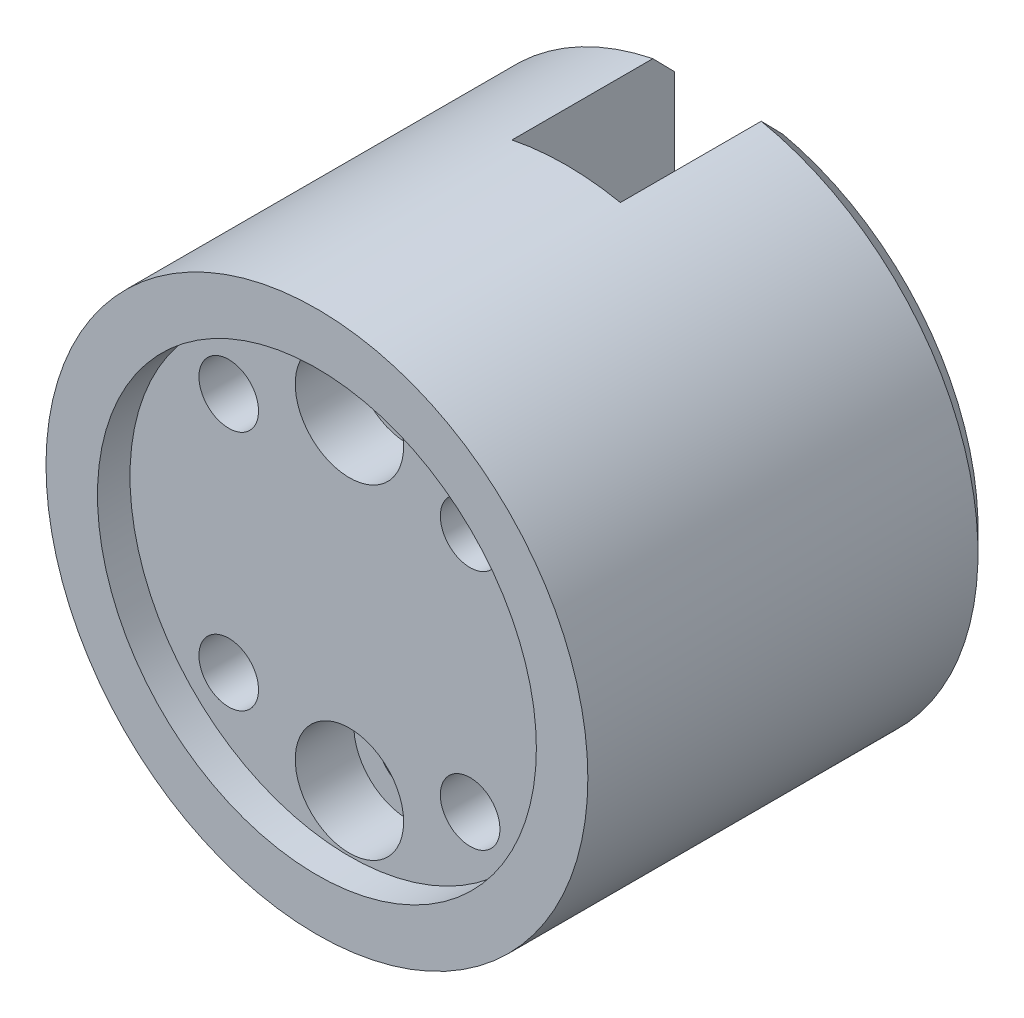
ISO-10303-21;
HEADER;
FILE_DESCRIPTION(('STEP AP214'),'2;1');
FILE_NAME('part.step','',(''),(''),'','','');
FILE_SCHEMA(('AUTOMOTIVE_DESIGN { 1 0 10303 214 1 1 1 1 }'));
ENDSEC;
DATA;
#1=APPLICATION_CONTEXT('core data for automotive mechanical design processes');
#2=APPLICATION_PROTOCOL_DEFINITION('international standard','automotive_design',2000,#1);
#3=PRODUCT_CONTEXT('',#1,'mechanical');
#4=PRODUCT('Part','Part','',(#3));
#5=PRODUCT_RELATED_PRODUCT_CATEGORY('part','',(#4));
#6=PRODUCT_DEFINITION_FORMATION('','',#4);
#7=PRODUCT_DEFINITION_CONTEXT('part definition',#1,'design');
#8=PRODUCT_DEFINITION('design','',#6,#7);
#9=PRODUCT_DEFINITION_SHAPE('','',#8);
#10=(LENGTH_UNIT() NAMED_UNIT(*) SI_UNIT(.MILLI.,.METRE.));
#11=(NAMED_UNIT(*) PLANE_ANGLE_UNIT() SI_UNIT($,.RADIAN.));
#12=(NAMED_UNIT(*) SI_UNIT($,.STERADIAN.) SOLID_ANGLE_UNIT());
#13=UNCERTAINTY_MEASURE_WITH_UNIT(LENGTH_MEASURE(1.E-05),#10,'distance_accuracy_value','');
#14=(GEOMETRIC_REPRESENTATION_CONTEXT(3) GLOBAL_UNCERTAINTY_ASSIGNED_CONTEXT((#13)) GLOBAL_UNIT_ASSIGNED_CONTEXT((#10,
#11,#12)) REPRESENTATION_CONTEXT('',''));
#15=CARTESIAN_POINT('',(0.,0.,0.));
#16=DIRECTION('',(0.,0.,1.));
#17=DIRECTION('',(1.,0.,0.));
#18=AXIS2_PLACEMENT_3D('',#15,#16,#17);
#19=CARTESIAN_POINT('',(0.,0.,-20.));
#20=DIRECTION('',(0.,0.,-1.));
#21=DIRECTION('',(-1.,0.,0.));
#22=AXIS2_PLACEMENT_3D('',#19,#20,#21);
#23=PLANE('',#22);
#24=DIRECTION('',(0.,1.,0.));
#25=VECTOR('',#24,1.);
#26=CARTESIAN_POINT('',(-5.00000000000162,0.,-20.));
#27=LINE('',#26,#25);
#28=CARTESIAN_POINT('',(-5.00000000000162,-22.4499443206433,-20.));
#29=VERTEX_POINT('',#28);
#30=CARTESIAN_POINT('',(-5.00000000000162,22.4499443206433,-20.));
#31=VERTEX_POINT('',#30);
#32=EDGE_CURVE('E121',#29,#31,#27,.T.);
#33=ORIENTED_EDGE('',*,*,#32,.F.);
#34=CARTESIAN_POINT('',(0.,0.,-20.));
#35=DIRECTION('',(0.,0.,-1.));
#36=DIRECTION('',(-1.,0.,0.));
#37=AXIS2_PLACEMENT_3D('',#34,#35,#36);
#38=CIRCLE('',#37,23.);
#39=EDGE_CURVE('E166',#29,#31,#38,.T.);
#40=ORIENTED_EDGE('',*,*,#39,.T.);
#41=EDGE_LOOP('',(#33,#40));
#42=FACE_BOUND('',#41,.T.);
#43=CARTESIAN_POINT('',(-11.136931803688,11.1369318036882,-20.));
#44=DIRECTION('',(0.,0.,-1.));
#45=DIRECTION('',(-1.,0.,0.));
#46=AXIS2_PLACEMENT_3D('',#43,#44,#45);
#47=CIRCLE('',#46,5.);
#48=CARTESIAN_POINT('',(-16.136931803688,11.1369318036882,-20.));
#49=VERTEX_POINT('',#48);
#50=EDGE_CURVE('E260',#49,#49,#47,.T.);
#51=ORIENTED_EDGE('',*,*,#50,.F.);
#52=EDGE_LOOP('',(#51));
#53=FACE_BOUND('',#52,.T.);
#54=CARTESIAN_POINT('',(-11.136931803688,-11.1369318036881,-20.));
#55=DIRECTION('',(0.,0.,-1.));
#56=DIRECTION('',(-1.,0.,0.));
#57=AXIS2_PLACEMENT_3D('',#54,#55,#56);
#58=CIRCLE('',#57,5.);
#59=CARTESIAN_POINT('',(-16.136931803688,-11.1369318036881,-20.));
#60=VERTEX_POINT('',#59);
#61=EDGE_CURVE('E254',#60,#60,#58,.T.);
#62=ORIENTED_EDGE('',*,*,#61,.F.);
#63=EDGE_LOOP('',(#62));
#64=FACE_BOUND('',#63,.T.);
#65=ADVANCED_FACE('F33',(#42,#53,#64),#23,.T.);
#66=CARTESIAN_POINT('',(0.,0.,15.));
#67=DIRECTION('',(0.,0.,1.));
#68=DIRECTION('',(1.,0.,0.));
#69=AXIS2_PLACEMENT_3D('',#66,#67,#68);
#70=PLANE('',#69);
#71=CARTESIAN_POINT('',(0.,-15.,15.));
#72=DIRECTION('',(0.,0.,1.));
#73=DIRECTION('',(1.,0.,0.));
#74=AXIS2_PLACEMENT_3D('',#71,#72,#73);
#75=CIRCLE('',#74,5.);
#76=CARTESIAN_POINT('',(5.,-15.,15.));
#77=VERTEX_POINT('',#76);
#78=EDGE_CURVE('E283',#77,#77,#75,.T.);
#79=ORIENTED_EDGE('',*,*,#78,.F.);
#80=EDGE_LOOP('',(#79));
#81=FACE_BOUND('',#80,.T.);
#82=CARTESIAN_POINT('',(0.,15.,15.));
#83=DIRECTION('',(0.,0.,1.));
#84=DIRECTION('',(1.,0.,0.));
#85=AXIS2_PLACEMENT_3D('',#82,#83,#84);
#86=CIRCLE('',#85,5.);
#87=CARTESIAN_POINT('',(5.,15.,15.));
#88=VERTEX_POINT('',#87);
#89=EDGE_CURVE('E131',#88,#88,#86,.T.);
#90=ORIENTED_EDGE('',*,*,#89,.F.);
#91=EDGE_LOOP('',(#90));
#92=FACE_BOUND('',#91,.T.);
#93=CARTESIAN_POINT('',(-11.136931803688,-11.1369318036881,15.));
#94=DIRECTION('',(0.,0.,-1.));
#95=DIRECTION('',(-1.,0.,0.));
#96=AXIS2_PLACEMENT_3D('',#93,#94,#95);
#97=CIRCLE('',#96,2.75);
#98=CARTESIAN_POINT('',(-13.886931803688,-11.1369318036881,15.));
#99=VERTEX_POINT('',#98);
#100=EDGE_CURVE('E179',#99,#99,#97,.T.);
#101=ORIENTED_EDGE('',*,*,#100,.T.);
#102=EDGE_LOOP('',(#101));
#103=FACE_BOUND('',#102,.T.);
#104=CARTESIAN_POINT('',(11.136931803688,-11.1369318036881,15.));
#105=DIRECTION('',(0.,0.,-1.));
#106=DIRECTION('',(-1.,0.,0.));
#107=AXIS2_PLACEMENT_3D('',#104,#105,#106);
#108=CIRCLE('',#107,2.75);
#109=CARTESIAN_POINT('',(8.38693180368803,-11.1369318036881,15.));
#110=VERTEX_POINT('',#109);
#111=EDGE_CURVE('E184',#110,#110,#108,.T.);
#112=ORIENTED_EDGE('',*,*,#111,.T.);
#113=EDGE_LOOP('',(#112));
#114=FACE_BOUND('',#113,.T.);
#115=CARTESIAN_POINT('',(-11.136931803688,11.1369318036882,15.));
#116=DIRECTION('',(0.,0.,-1.));
#117=DIRECTION('',(-1.,0.,0.));
#118=AXIS2_PLACEMENT_3D('',#115,#116,#117);
#119=CIRCLE('',#118,2.75);
#120=CARTESIAN_POINT('',(-13.886931803688,11.1369318036882,15.));
#121=VERTEX_POINT('',#120);
#122=EDGE_CURVE('E187',#121,#121,#119,.T.);
#123=ORIENTED_EDGE('',*,*,#122,.T.);
#124=EDGE_LOOP('',(#123));
#125=FACE_BOUND('',#124,.T.);
#126=CARTESIAN_POINT('',(11.136931803688,11.1369318036882,15.));
#127=DIRECTION('',(0.,0.,-1.));
#128=DIRECTION('',(-1.,0.,0.));
#129=AXIS2_PLACEMENT_3D('',#126,#127,#128);
#130=CIRCLE('',#129,2.75);
#131=CARTESIAN_POINT('',(8.38693180368803,11.1369318036882,15.));
#132=VERTEX_POINT('',#131);
#133=EDGE_CURVE('E190',#132,#132,#130,.T.);
#134=ORIENTED_EDGE('',*,*,#133,.T.);
#135=EDGE_LOOP('',(#134));
#136=FACE_BOUND('',#135,.T.);
#137=CARTESIAN_POINT('',(0.,0.,15.));
#138=DIRECTION('',(0.,0.,1.));
#139=DIRECTION('',(1.,0.,0.));
#140=AXIS2_PLACEMENT_3D('',#137,#138,#139);
#141=CIRCLE('',#140,20.25);
#142=CARTESIAN_POINT('',(20.25,0.,15.));
#143=VERTEX_POINT('',#142);
#144=EDGE_CURVE('E176',#143,#143,#141,.T.);
#145=ORIENTED_EDGE('',*,*,#144,.T.);
#146=EDGE_LOOP('',(#145));
#147=FACE_BOUND('',#146,.T.);
#148=ADVANCED_FACE('F289',(#81,#92,#103,#114,#125,#136,#147),#70,.T.);
#149=CARTESIAN_POINT('',(0.,0.,15.));
#150=DIRECTION('',(0.,0.,-1.));
#151=DIRECTION('',(-1.,0.,0.));
#152=AXIS2_PLACEMENT_3D('',#149,#150,#151);
#153=CYLINDRICAL_SURFACE('',#152,25.);
#154=CARTESIAN_POINT('',(0.,0.,18.));
#155=DIRECTION('',(0.,0.,1.));
#156=DIRECTION('',(1.,0.,0.));
#157=AXIS2_PLACEMENT_3D('',#154,#155,#156);
#158=CIRCLE('',#157,25.);
#159=CARTESIAN_POINT('',(25.,0.,18.));
#160=VERTEX_POINT('',#159);
#161=EDGE_CURVE('E193',#160,#160,#158,.T.);
#162=ORIENTED_EDGE('',*,*,#161,.F.);
#163=EDGE_LOOP('',(#162));
#164=FACE_BOUND('',#163,.T.);
#165=DIRECTION('',(0.,0.,-1.));
#166=VECTOR('',#165,1.);
#167=CARTESIAN_POINT('',(4.9999999999983,-24.4948974278321,15.));
#168=LINE('',#167,#166);
#169=CARTESIAN_POINT('',(4.9999999999983,-24.4948974278321,-5.00000000000126));
#170=VERTEX_POINT('',#169);
#171=CARTESIAN_POINT('',(4.9999999999983,-24.4948974278321,-18.));
#172=VERTEX_POINT('',#171);
#173=EDGE_CURVE('E91',#170,#172,#168,.T.);
#174=ORIENTED_EDGE('',*,*,#173,.T.);
#175=CARTESIAN_POINT('',(0.,0.,-18.));
#176=DIRECTION('',(0.,0.,-1.));
#177=DIRECTION('',(-1.,0.,0.));
#178=AXIS2_PLACEMENT_3D('',#175,#176,#177);
#179=CIRCLE('',#178,25.);
#180=CARTESIAN_POINT('',(4.9999999999983,24.4948974278321,-18.));
#181=VERTEX_POINT('',#180);
#182=EDGE_CURVE('E168',#172,#181,#179,.F.);
#183=ORIENTED_EDGE('',*,*,#182,.T.);
#184=DIRECTION('',(0.,0.,-1.));
#185=VECTOR('',#184,1.);
#186=CARTESIAN_POINT('',(4.9999999999983,24.4948974278321,15.));
#187=LINE('',#186,#185);
#188=CARTESIAN_POINT('',(4.9999999999983,24.4948974278321,-5.00000000000126));
#189=VERTEX_POINT('',#188);
#190=EDGE_CURVE('E102',#181,#189,#187,.F.);
#191=ORIENTED_EDGE('',*,*,#190,.T.);
#192=CARTESIAN_POINT('',(0.,0.,-5.00000000000126));
#193=DIRECTION('',(0.,0.,1.));
#194=DIRECTION('',(1.,0.,0.));
#195=AXIS2_PLACEMENT_3D('',#192,#193,#194);
#196=CIRCLE('',#195,25.);
#197=CARTESIAN_POINT('',(-5.00000000000162,24.4948974278315,-5.00000000000126));
#198=VERTEX_POINT('',#197);
#199=EDGE_CURVE('E112',#189,#198,#196,.T.);
#200=ORIENTED_EDGE('',*,*,#199,.T.);
#201=DIRECTION('',(0.,0.,-1.));
#202=VECTOR('',#201,1.);
#203=CARTESIAN_POINT('',(-5.00000000000162,24.4948974278315,15.));
#204=LINE('',#203,#202);
#205=CARTESIAN_POINT('',(-5.00000000000162,24.4948974278315,-18.));
#206=VERTEX_POINT('',#205);
#207=EDGE_CURVE('E171',#198,#206,#204,.T.);
#208=ORIENTED_EDGE('',*,*,#207,.T.);
#209=CARTESIAN_POINT('',(0.,0.,-18.));
#210=DIRECTION('',(0.,0.,-1.));
#211=DIRECTION('',(-1.,0.,0.));
#212=AXIS2_PLACEMENT_3D('',#209,#210,#211);
#213=CIRCLE('',#212,25.);
#214=CARTESIAN_POINT('',(-5.00000000000162,-24.4948974278315,-18.));
#215=VERTEX_POINT('',#214);
#216=EDGE_CURVE('E169',#206,#215,#213,.F.);
#217=ORIENTED_EDGE('',*,*,#216,.T.);
#218=DIRECTION('',(0.,0.,-1.));
#219=VECTOR('',#218,1.);
#220=CARTESIAN_POINT('',(-5.00000000000162,-24.4948974278315,15.));
#221=LINE('',#220,#219);
#222=CARTESIAN_POINT('',(-5.00000000000162,-24.4948974278315,-5.00000000000126));
#223=VERTEX_POINT('',#222);
#224=EDGE_CURVE('E101',#215,#223,#221,.F.);
#225=ORIENTED_EDGE('',*,*,#224,.T.);
#226=EDGE_CURVE('E109',#223,#170,#196,.T.);
#227=ORIENTED_EDGE('',*,*,#226,.T.);
#228=EDGE_LOOP('',(#174,#183,#191,#200,#208,#217,#225,#227));
#229=FACE_BOUND('',#228,.T.);
#230=ADVANCED_FACE('F115',(#164,#229),#153,.T.);
#231=CARTESIAN_POINT('',(-11.136931803688,-11.1369318036881,0.));
#232=DIRECTION('',(0.,0.,-1.));
#233=DIRECTION('',(-1.,0.,0.));
#234=AXIS2_PLACEMENT_3D('',#231,#232,#233);
#235=CYLINDRICAL_SURFACE('',#234,2.74999999999999);
#236=CARTESIAN_POINT('',(-11.136931803688,-11.1369318036881,5.4));
#237=DIRECTION('',(0.,0.,-1.));
#238=DIRECTION('',(-1.,0.,0.));
#239=AXIS2_PLACEMENT_3D('',#236,#237,#238);
#240=CIRCLE('',#239,2.75);
#241=CARTESIAN_POINT('',(-13.886931803688,-11.1369318036881,5.4));
#242=VERTEX_POINT('',#241);
#243=EDGE_CURVE('E208',#242,#242,#240,.T.);
#244=ORIENTED_EDGE('',*,*,#243,.T.);
#245=EDGE_LOOP('',(#244));
#246=FACE_BOUND('',#245,.T.);
#247=ORIENTED_EDGE('',*,*,#100,.F.);
#248=EDGE_LOOP('',(#247));
#249=FACE_BOUND('',#248,.T.);
#250=ADVANCED_FACE('F560',(#246,#249),#235,.F.);
#251=CARTESIAN_POINT('',(11.136931803688,-11.1369318036881,0.));
#252=DIRECTION('',(0.,0.,-1.));
#253=DIRECTION('',(-1.,0.,0.));
#254=AXIS2_PLACEMENT_3D('',#251,#252,#253);
#255=CYLINDRICAL_SURFACE('',#254,2.74999999999999);
#256=CARTESIAN_POINT('',(11.136931803688,-11.1369318036881,5.4));
#257=DIRECTION('',(0.,0.,-1.));
#258=DIRECTION('',(-1.,0.,0.));
#259=AXIS2_PLACEMENT_3D('',#256,#257,#258);
#260=CIRCLE('',#259,2.75);
#261=CARTESIAN_POINT('',(8.38693180368802,-11.1369318036881,5.4));
#262=VERTEX_POINT('',#261);
#263=EDGE_CURVE('E226',#262,#262,#260,.T.);
#264=ORIENTED_EDGE('',*,*,#263,.T.);
#265=EDGE_LOOP('',(#264));
#266=FACE_BOUND('',#265,.T.);
#267=ORIENTED_EDGE('',*,*,#111,.F.);
#268=EDGE_LOOP('',(#267));
#269=FACE_BOUND('',#268,.T.);
#270=ADVANCED_FACE('F597',(#266,#269),#255,.F.);
#271=CARTESIAN_POINT('',(-11.136931803688,11.1369318036882,0.));
#272=DIRECTION('',(0.,0.,-1.));
#273=DIRECTION('',(-1.,0.,0.));
#274=AXIS2_PLACEMENT_3D('',#271,#272,#273);
#275=CYLINDRICAL_SURFACE('',#274,2.74999999999999);
#276=CARTESIAN_POINT('',(-11.136931803688,11.1369318036882,5.4));
#277=DIRECTION('',(0.,0.,-1.));
#278=DIRECTION('',(-1.,0.,0.));
#279=AXIS2_PLACEMENT_3D('',#276,#277,#278);
#280=CIRCLE('',#279,2.75);
#281=CARTESIAN_POINT('',(-13.886931803688,11.1369318036882,5.4));
#282=VERTEX_POINT('',#281);
#283=EDGE_CURVE('E199',#282,#282,#280,.T.);
#284=ORIENTED_EDGE('',*,*,#283,.T.);
#285=EDGE_LOOP('',(#284));
#286=FACE_BOUND('',#285,.T.);
#287=ORIENTED_EDGE('',*,*,#122,.F.);
#288=EDGE_LOOP('',(#287));
#289=FACE_BOUND('',#288,.T.);
#290=ADVANCED_FACE('F605',(#286,#289),#275,.F.);
#291=CARTESIAN_POINT('',(11.136931803688,11.1369318036882,0.));
#292=DIRECTION('',(0.,0.,-1.));
#293=DIRECTION('',(-1.,0.,0.));
#294=AXIS2_PLACEMENT_3D('',#291,#292,#293);
#295=CYLINDRICAL_SURFACE('',#294,2.74999999999999);
#296=CARTESIAN_POINT('',(11.136931803688,11.1369318036882,5.4));
#297=DIRECTION('',(0.,0.,-1.));
#298=DIRECTION('',(-1.,0.,0.));
#299=AXIS2_PLACEMENT_3D('',#296,#297,#298);
#300=CIRCLE('',#299,2.75);
#301=CARTESIAN_POINT('',(8.38693180368802,11.1369318036882,5.4));
#302=VERTEX_POINT('',#301);
#303=EDGE_CURVE('E217',#302,#302,#300,.T.);
#304=ORIENTED_EDGE('',*,*,#303,.T.);
#305=EDGE_LOOP('',(#304));
#306=FACE_BOUND('',#305,.T.);
#307=ORIENTED_EDGE('',*,*,#133,.F.);
#308=EDGE_LOOP('',(#307));
#309=FACE_BOUND('',#308,.T.);
#310=ADVANCED_FACE('F318',(#306,#309),#295,.F.);
#311=CARTESIAN_POINT('',(0.,0.,18.));
#312=DIRECTION('',(0.,0.,1.));
#313=DIRECTION('',(1.,0.,0.));
#314=AXIS2_PLACEMENT_3D('',#311,#312,#313);
#315=PLANE('',#314);
#316=ORIENTED_EDGE('',*,*,#161,.T.);
#317=EDGE_LOOP('',(#316));
#318=FACE_BOUND('',#317,.T.);
#319=CARTESIAN_POINT('',(0.,0.,18.));
#320=DIRECTION('',(0.,0.,1.));
#321=DIRECTION('',(1.,0.,0.));
#322=AXIS2_PLACEMENT_3D('',#319,#320,#321);
#323=CIRCLE('',#322,20.25);
#324=CARTESIAN_POINT('',(20.25,0.,18.));
#325=VERTEX_POINT('',#324);
#326=EDGE_CURVE('E195',#325,#325,#323,.T.);
#327=ORIENTED_EDGE('',*,*,#326,.F.);
#328=EDGE_LOOP('',(#327));
#329=FACE_BOUND('',#328,.T.);
#330=ADVANCED_FACE('F308',(#318,#329),#315,.T.);
#331=CARTESIAN_POINT('',(0.,0.,18.));
#332=DIRECTION('',(0.,0.,-1.));
#333=DIRECTION('',(-1.,0.,0.));
#334=AXIS2_PLACEMENT_3D('',#331,#332,#333);
#335=CYLINDRICAL_SURFACE('',#334,20.25);
#336=ORIENTED_EDGE('',*,*,#326,.T.);
#337=EDGE_LOOP('',(#336));
#338=FACE_BOUND('',#337,.T.);
#339=ORIENTED_EDGE('',*,*,#144,.F.);
#340=EDGE_LOOP('',(#339));
#341=FACE_BOUND('',#340,.T.);
#342=ADVANCED_FACE('F305',(#338,#341),#335,.F.);
#343=CARTESIAN_POINT('',(-6.13693180368802,11.1369318036882,5.4));
#344=DIRECTION('',(0.,0.,1.));
#345=DIRECTION('',(1.,0.,0.));
#346=AXIS2_PLACEMENT_3D('',#343,#344,#345);
#347=PLANE('',#346);
#348=ORIENTED_EDGE('',*,*,#283,.F.);
#349=EDGE_LOOP('',(#348));
#350=FACE_BOUND('',#349,.T.);
#351=CARTESIAN_POINT('',(-11.136931803688,11.1369318036882,5.4));
#352=DIRECTION('',(0.,0.,-1.));
#353=DIRECTION('',(-1.,0.,0.));
#354=AXIS2_PLACEMENT_3D('',#351,#352,#353);
#355=CIRCLE('',#354,5.);
#356=CARTESIAN_POINT('',(-16.136931803688,11.1369318036882,5.4));
#357=VERTEX_POINT('',#356);
#358=EDGE_CURVE('E202',#357,#357,#355,.T.);
#359=ORIENTED_EDGE('',*,*,#358,.T.);
#360=EDGE_LOOP('',(#359));
#361=FACE_BOUND('',#360,.T.);
#362=ADVANCED_FACE('F307',(#350,#361),#347,.F.);
#363=CARTESIAN_POINT('',(-11.136931803688,11.1369318036882,0.));
#364=DIRECTION('',(0.,0.,-1.));
#365=DIRECTION('',(-1.,0.,0.));
#366=AXIS2_PLACEMENT_3D('',#363,#364,#365);
#367=CYLINDRICAL_SURFACE('',#366,5.);
#368=ORIENTED_EDGE('',*,*,#358,.F.);
#369=EDGE_LOOP('',(#368));
#370=FACE_BOUND('',#369,.T.);
#371=CARTESIAN_POINT('',(-11.136931803688,11.1369318036882,0.0250000000000025));
#372=DIRECTION('',(0.,0.,-1.));
#373=DIRECTION('',(-1.,0.,0.));
#374=AXIS2_PLACEMENT_3D('',#371,#372,#373);
#375=CIRCLE('',#374,5.);
#376=CARTESIAN_POINT('',(-16.136931803688,11.1369318036882,0.0250000000000025));
#377=VERTEX_POINT('',#376);
#378=EDGE_CURVE('E205',#377,#377,#375,.T.);
#379=ORIENTED_EDGE('',*,*,#378,.T.);
#380=EDGE_LOOP('',(#379));
#381=FACE_BOUND('',#380,.T.);
#382=ADVANCED_FACE('F315',(#370,#381),#367,.F.);
#383=CARTESIAN_POINT('',(-11.136931803688,11.1369318036882,0.));
#384=DIRECTION('',(0.,0.,-1.));
#385=DIRECTION('',(-1.,0.,0.));
#386=AXIS2_PLACEMENT_3D('',#383,#384,#385);
#387=CONICAL_SURFACE('',#386,5.025,0.785398163397466);
#388=ORIENTED_EDGE('',*,*,#378,.F.);
#389=EDGE_LOOP('',(#388));
#390=FACE_BOUND('',#389,.T.);
#391=CARTESIAN_POINT('',(-11.136931803688,11.1369318036882,0.));
#392=DIRECTION('',(0.,0.,-1.));
#393=DIRECTION('',(-1.,0.,0.));
#394=AXIS2_PLACEMENT_3D('',#391,#392,#393);
#395=CIRCLE('',#394,5.025);
#396=CARTESIAN_POINT('',(-16.161931803688,11.1369318036882,0.));
#397=VERTEX_POINT('',#396);
#398=EDGE_CURVE('E235',#397,#397,#395,.F.);
#399=ORIENTED_EDGE('',*,*,#398,.F.);
#400=EDGE_LOOP('',(#399));
#401=FACE_BOUND('',#400,.T.);
#402=ADVANCED_FACE('F386',(#390,#401),#387,.F.);
#403=CARTESIAN_POINT('',(-6.13693180368802,-11.1369318036881,5.4));
#404=DIRECTION('',(0.,0.,1.));
#405=DIRECTION('',(1.,0.,0.));
#406=AXIS2_PLACEMENT_3D('',#403,#404,#405);
#407=PLANE('',#406);
#408=ORIENTED_EDGE('',*,*,#243,.F.);
#409=EDGE_LOOP('',(#408));
#410=FACE_BOUND('',#409,.T.);
#411=CARTESIAN_POINT('',(-11.136931803688,-11.1369318036881,5.4));
#412=DIRECTION('',(0.,0.,-1.));
#413=DIRECTION('',(-1.,0.,0.));
#414=AXIS2_PLACEMENT_3D('',#411,#412,#413);
#415=CIRCLE('',#414,5.);
#416=CARTESIAN_POINT('',(-16.136931803688,-11.1369318036881,5.4));
#417=VERTEX_POINT('',#416);
#418=EDGE_CURVE('E211',#417,#417,#415,.T.);
#419=ORIENTED_EDGE('',*,*,#418,.T.);
#420=EDGE_LOOP('',(#419));
#421=FACE_BOUND('',#420,.T.);
#422=ADVANCED_FACE('F382',(#410,#421),#407,.F.);
#423=CARTESIAN_POINT('',(-11.136931803688,-11.1369318036881,0.));
#424=DIRECTION('',(0.,0.,-1.));
#425=DIRECTION('',(-1.,0.,0.));
#426=AXIS2_PLACEMENT_3D('',#423,#424,#425);
#427=CYLINDRICAL_SURFACE('',#426,5.);
#428=ORIENTED_EDGE('',*,*,#418,.F.);
#429=EDGE_LOOP('',(#428));
#430=FACE_BOUND('',#429,.T.);
#431=CARTESIAN_POINT('',(-11.136931803688,-11.1369318036881,0.0250000000000025));
#432=DIRECTION('',(0.,0.,-1.));
#433=DIRECTION('',(-1.,0.,0.));
#434=AXIS2_PLACEMENT_3D('',#431,#432,#433);
#435=CIRCLE('',#434,5.);
#436=CARTESIAN_POINT('',(-16.136931803688,-11.1369318036881,0.0250000000000025));
#437=VERTEX_POINT('',#436);
#438=EDGE_CURVE('E214',#437,#437,#435,.T.);
#439=ORIENTED_EDGE('',*,*,#438,.T.);
#440=EDGE_LOOP('',(#439));
#441=FACE_BOUND('',#440,.T.);
#442=ADVANCED_FACE('F378',(#430,#441),#427,.F.);
#443=CARTESIAN_POINT('',(-11.136931803688,-11.1369318036881,0.));
#444=DIRECTION('',(0.,0.,-1.));
#445=DIRECTION('',(-1.,0.,0.));
#446=AXIS2_PLACEMENT_3D('',#443,#444,#445);
#447=CONICAL_SURFACE('',#446,5.025,0.785398163397466);
#448=ORIENTED_EDGE('',*,*,#438,.F.);
#449=EDGE_LOOP('',(#448));
#450=FACE_BOUND('',#449,.T.);
#451=CARTESIAN_POINT('',(-11.136931803688,-11.1369318036881,0.));
#452=DIRECTION('',(0.,0.,-1.));
#453=DIRECTION('',(-1.,0.,0.));
#454=AXIS2_PLACEMENT_3D('',#451,#452,#453);
#455=CIRCLE('',#454,5.025);
#456=CARTESIAN_POINT('',(-16.161931803688,-11.1369318036881,0.));
#457=VERTEX_POINT('',#456);
#458=EDGE_CURVE('E238',#457,#457,#455,.F.);
#459=ORIENTED_EDGE('',*,*,#458,.F.);
#460=EDGE_LOOP('',(#459));
#461=FACE_BOUND('',#460,.T.);
#462=ADVANCED_FACE('F374',(#450,#461),#447,.F.);
#463=CARTESIAN_POINT('',(16.136931803688,11.1369318036882,5.4));
#464=DIRECTION('',(0.,0.,1.));
#465=DIRECTION('',(1.,0.,0.));
#466=AXIS2_PLACEMENT_3D('',#463,#464,#465);
#467=PLANE('',#466);
#468=ORIENTED_EDGE('',*,*,#303,.F.);
#469=EDGE_LOOP('',(#468));
#470=FACE_BOUND('',#469,.T.);
#471=CARTESIAN_POINT('',(11.136931803688,11.1369318036882,5.4));
#472=DIRECTION('',(0.,0.,-1.));
#473=DIRECTION('',(-1.,0.,0.));
#474=AXIS2_PLACEMENT_3D('',#471,#472,#473);
#475=CIRCLE('',#474,5.);
#476=CARTESIAN_POINT('',(6.13693180368802,11.1369318036882,5.4));
#477=VERTEX_POINT('',#476);
#478=EDGE_CURVE('E220',#477,#477,#475,.T.);
#479=ORIENTED_EDGE('',*,*,#478,.T.);
#480=EDGE_LOOP('',(#479));
#481=FACE_BOUND('',#480,.T.);
#482=ADVANCED_FACE('F366',(#470,#481),#467,.F.);
#483=CARTESIAN_POINT('',(11.136931803688,11.1369318036882,0.));
#484=DIRECTION('',(0.,0.,-1.));
#485=DIRECTION('',(-1.,0.,0.));
#486=AXIS2_PLACEMENT_3D('',#483,#484,#485);
#487=CYLINDRICAL_SURFACE('',#486,5.);
#488=ORIENTED_EDGE('',*,*,#478,.F.);
#489=EDGE_LOOP('',(#488));
#490=FACE_BOUND('',#489,.T.);
#491=CARTESIAN_POINT('',(11.136931803688,11.1369318036882,0.0250000000000025));
#492=DIRECTION('',(0.,0.,-1.));
#493=DIRECTION('',(-1.,0.,0.));
#494=AXIS2_PLACEMENT_3D('',#491,#492,#493);
#495=CIRCLE('',#494,5.);
#496=CARTESIAN_POINT('',(6.13693180368802,11.1369318036882,0.0250000000000025));
#497=VERTEX_POINT('',#496);
#498=EDGE_CURVE('E223',#497,#497,#495,.T.);
#499=ORIENTED_EDGE('',*,*,#498,.T.);
#500=EDGE_LOOP('',(#499));
#501=FACE_BOUND('',#500,.T.);
#502=ADVANCED_FACE('F356',(#490,#501),#487,.F.);
#503=CARTESIAN_POINT('',(11.136931803688,11.1369318036882,0.));
#504=DIRECTION('',(0.,0.,-1.));
#505=DIRECTION('',(-1.,0.,0.));
#506=AXIS2_PLACEMENT_3D('',#503,#504,#505);
#507=CONICAL_SURFACE('',#506,5.025,0.785398163397466);
#508=ORIENTED_EDGE('',*,*,#498,.F.);
#509=EDGE_LOOP('',(#508));
#510=FACE_BOUND('',#509,.T.);
#511=CARTESIAN_POINT('',(11.136931803688,11.1369318036882,0.));
#512=DIRECTION('',(0.,0.,-1.));
#513=DIRECTION('',(-1.,0.,0.));
#514=AXIS2_PLACEMENT_3D('',#511,#512,#513);
#515=CIRCLE('',#514,5.025);
#516=CARTESIAN_POINT('',(6.11193180368802,11.1369318036882,0.));
#517=VERTEX_POINT('',#516);
#518=EDGE_CURVE('E251',#517,#517,#515,.T.);
#519=ORIENTED_EDGE('',*,*,#518,.T.);
#520=EDGE_LOOP('',(#519));
#521=FACE_BOUND('',#520,.T.);
#522=ADVANCED_FACE('F353',(#510,#521),#507,.F.);
#523=CARTESIAN_POINT('',(16.136931803688,-11.1369318036881,5.4));
#524=DIRECTION('',(0.,0.,1.));
#525=DIRECTION('',(1.,0.,0.));
#526=AXIS2_PLACEMENT_3D('',#523,#524,#525);
#527=PLANE('',#526);
#528=ORIENTED_EDGE('',*,*,#263,.F.);
#529=EDGE_LOOP('',(#528));
#530=FACE_BOUND('',#529,.T.);
#531=CARTESIAN_POINT('',(11.136931803688,-11.1369318036881,5.4));
#532=DIRECTION('',(0.,0.,-1.));
#533=DIRECTION('',(-1.,0.,0.));
#534=AXIS2_PLACEMENT_3D('',#531,#532,#533);
#535=CIRCLE('',#534,5.);
#536=CARTESIAN_POINT('',(6.13693180368802,-11.1369318036881,5.4));
#537=VERTEX_POINT('',#536);
#538=EDGE_CURVE('E229',#537,#537,#535,.T.);
#539=ORIENTED_EDGE('',*,*,#538,.T.);
#540=EDGE_LOOP('',(#539));
#541=FACE_BOUND('',#540,.T.);
#542=ADVANCED_FACE('F355',(#530,#541),#527,.F.);
#543=CARTESIAN_POINT('',(11.136931803688,-11.1369318036881,0.));
#544=DIRECTION('',(0.,0.,-1.));
#545=DIRECTION('',(-1.,0.,0.));
#546=AXIS2_PLACEMENT_3D('',#543,#544,#545);
#547=CYLINDRICAL_SURFACE('',#546,5.);
#548=ORIENTED_EDGE('',*,*,#538,.F.);
#549=EDGE_LOOP('',(#548));
#550=FACE_BOUND('',#549,.T.);
#551=CARTESIAN_POINT('',(11.136931803688,-11.1369318036881,0.0250000000000025));
#552=DIRECTION('',(0.,0.,-1.));
#553=DIRECTION('',(-1.,0.,0.));
#554=AXIS2_PLACEMENT_3D('',#551,#552,#553);
#555=CIRCLE('',#554,5.);
#556=CARTESIAN_POINT('',(6.13693180368802,-11.1369318036881,0.0250000000000025));
#557=VERTEX_POINT('',#556);
#558=EDGE_CURVE('E232',#557,#557,#555,.T.);
#559=ORIENTED_EDGE('',*,*,#558,.T.);
#560=EDGE_LOOP('',(#559));
#561=FACE_BOUND('',#560,.T.);
#562=ADVANCED_FACE('F363',(#550,#561),#547,.F.);
#563=CARTESIAN_POINT('',(11.136931803688,-11.1369318036881,0.));
#564=DIRECTION('',(0.,0.,-1.));
#565=DIRECTION('',(-1.,0.,0.));
#566=AXIS2_PLACEMENT_3D('',#563,#564,#565);
#567=CONICAL_SURFACE('',#566,5.025,0.785398163397466);
#568=ORIENTED_EDGE('',*,*,#558,.F.);
#569=EDGE_LOOP('',(#568));
#570=FACE_BOUND('',#569,.T.);
#571=CARTESIAN_POINT('',(11.136931803688,-11.1369318036881,0.));
#572=DIRECTION('',(0.,0.,-1.));
#573=DIRECTION('',(-1.,0.,0.));
#574=AXIS2_PLACEMENT_3D('',#571,#572,#573);
#575=CIRCLE('',#574,5.025);
#576=CARTESIAN_POINT('',(6.11193180368802,-11.1369318036881,0.));
#577=VERTEX_POINT('',#576);
#578=EDGE_CURVE('E241',#577,#577,#575,.F.);
#579=ORIENTED_EDGE('',*,*,#578,.F.);
#580=EDGE_LOOP('',(#579));
#581=FACE_BOUND('',#580,.T.);
#582=ADVANCED_FACE('F402',(#570,#581),#567,.F.);
#583=CARTESIAN_POINT('',(0.,0.,0.));
#584=DIRECTION('',(0.,0.,-1.));
#585=DIRECTION('',(-1.,0.,0.));
#586=AXIS2_PLACEMENT_3D('',#583,#584,#585);
#587=PLANE('',#586);
#588=CARTESIAN_POINT('',(-11.136931803688,11.1369318036882,0.));
#589=DIRECTION('',(0.,0.,-1.));
#590=DIRECTION('',(-1.,0.,0.));
#591=AXIS2_PLACEMENT_3D('',#588,#589,#590);
#592=CIRCLE('',#591,5.);
#593=CARTESIAN_POINT('',(-16.136931803688,11.1369318036882,0.));
#594=VERTEX_POINT('',#593);
#595=EDGE_CURVE('E263',#594,#594,#592,.T.);
#596=ORIENTED_EDGE('',*,*,#595,.T.);
#597=EDGE_LOOP('',(#596));
#598=FACE_BOUND('',#597,.T.);
#599=ORIENTED_EDGE('',*,*,#398,.T.);
#600=EDGE_LOOP('',(#599));
#601=FACE_BOUND('',#600,.T.);
#602=ADVANCED_FACE('F340',(#598,#601),#587,.F.);
#603=CARTESIAN_POINT('',(-11.136931803688,-11.1369318036881,0.));
#604=DIRECTION('',(0.,0.,-1.));
#605=DIRECTION('',(-1.,0.,0.));
#606=AXIS2_PLACEMENT_3D('',#603,#604,#605);
#607=CIRCLE('',#606,5.);
#608=CARTESIAN_POINT('',(-16.136931803688,-11.1369318036881,0.));
#609=VERTEX_POINT('',#608);
#610=EDGE_CURVE('E257',#609,#609,#607,.T.);
#611=ORIENTED_EDGE('',*,*,#610,.T.);
#612=EDGE_LOOP('',(#611));
#613=FACE_BOUND('',#612,.T.);
#614=ORIENTED_EDGE('',*,*,#458,.T.);
#615=EDGE_LOOP('',(#614));
#616=FACE_BOUND('',#615,.T.);
#617=ADVANCED_FACE('F338',(#613,#616),#587,.F.);
#618=CARTESIAN_POINT('',(11.136931803688,-11.1369318036881,0.));
#619=DIRECTION('',(0.,0.,-1.));
#620=DIRECTION('',(-1.,0.,0.));
#621=AXIS2_PLACEMENT_3D('',#618,#619,#620);
#622=CIRCLE('',#621,5.);
#623=CARTESIAN_POINT('',(6.13693180368802,-11.1369318036881,0.));
#624=VERTEX_POINT('',#623);
#625=EDGE_CURVE('E245',#624,#624,#622,.T.);
#626=ORIENTED_EDGE('',*,*,#625,.T.);
#627=EDGE_LOOP('',(#626));
#628=FACE_BOUND('',#627,.T.);
#629=ORIENTED_EDGE('',*,*,#578,.T.);
#630=EDGE_LOOP('',(#629));
#631=FACE_BOUND('',#630,.T.);
#632=ADVANCED_FACE('F330',(#628,#631),#587,.F.);
#633=DIRECTION('',(0.,-1.,0.));
#634=VECTOR('',#633,1.);
#635=CARTESIAN_POINT('',(4.9999999999983,0.,-20.));
#636=LINE('',#635,#634);
#637=CARTESIAN_POINT('',(4.9999999999983,22.449944320644,-20.));
#638=VERTEX_POINT('',#637);
#639=CARTESIAN_POINT('',(4.9999999999983,-22.449944320644,-20.));
#640=VERTEX_POINT('',#639);
#641=EDGE_CURVE('E175',#638,#640,#636,.T.);
#642=ORIENTED_EDGE('',*,*,#641,.F.);
#643=CARTESIAN_POINT('',(0.,0.,-20.));
#644=DIRECTION('',(0.,0.,-1.));
#645=DIRECTION('',(-1.,0.,0.));
#646=AXIS2_PLACEMENT_3D('',#643,#644,#645);
#647=CIRCLE('',#646,23.);
#648=EDGE_CURVE('E116',#638,#640,#647,.T.);
#649=ORIENTED_EDGE('',*,*,#648,.T.);
#650=EDGE_LOOP('',(#642,#649));
#651=FACE_BOUND('',#650,.T.);
#652=CARTESIAN_POINT('',(11.136931803688,-11.1369318036881,-20.));
#653=DIRECTION('',(0.,0.,-1.));
#654=DIRECTION('',(-1.,0.,0.));
#655=AXIS2_PLACEMENT_3D('',#652,#653,#654);
#656=CIRCLE('',#655,5.);
#657=CARTESIAN_POINT('',(6.13693180368802,-11.1369318036881,-20.));
#658=VERTEX_POINT('',#657);
#659=EDGE_CURVE('E244',#658,#658,#656,.T.);
#660=ORIENTED_EDGE('',*,*,#659,.F.);
#661=EDGE_LOOP('',(#660));
#662=FACE_BOUND('',#661,.T.);
#663=CARTESIAN_POINT('',(11.136931803688,11.1369318036882,-20.));
#664=DIRECTION('',(0.,0.,-1.));
#665=DIRECTION('',(-1.,0.,0.));
#666=AXIS2_PLACEMENT_3D('',#663,#664,#665);
#667=CIRCLE('',#666,5.025);
#668=CARTESIAN_POINT('',(6.11193180368802,11.1369318036882,-20.));
#669=VERTEX_POINT('',#668);
#670=EDGE_CURVE('E248',#669,#669,#667,.T.);
#671=ORIENTED_EDGE('',*,*,#670,.F.);
#672=EDGE_LOOP('',(#671));
#673=FACE_BOUND('',#672,.T.);
#674=ADVANCED_FACE('F323',(#651,#662,#673),#23,.T.);
#675=CARTESIAN_POINT('',(11.136931803688,-11.1369318036881,-20.));
#676=DIRECTION('',(0.,0.,1.));
#677=DIRECTION('',(1.,0.,0.));
#678=AXIS2_PLACEMENT_3D('',#675,#676,#677);
#679=CYLINDRICAL_SURFACE('',#678,5.);
#680=ORIENTED_EDGE('',*,*,#659,.T.);
#681=EDGE_LOOP('',(#680));
#682=FACE_BOUND('',#681,.T.);
#683=ORIENTED_EDGE('',*,*,#625,.F.);
#684=EDGE_LOOP('',(#683));
#685=FACE_BOUND('',#684,.T.);
#686=ADVANCED_FACE('F329',(#682,#685),#679,.F.);
#687=CARTESIAN_POINT('',(11.136931803688,11.1369318036882,-20.));
#688=DIRECTION('',(0.,0.,1.));
#689=DIRECTION('',(1.,0.,0.));
#690=AXIS2_PLACEMENT_3D('',#687,#688,#689);
#691=CYLINDRICAL_SURFACE('',#690,5.025);
#692=ORIENTED_EDGE('',*,*,#670,.T.);
#693=EDGE_LOOP('',(#692));
#694=FACE_BOUND('',#693,.T.);
#695=ORIENTED_EDGE('',*,*,#518,.F.);
#696=EDGE_LOOP('',(#695));
#697=FACE_BOUND('',#696,.T.);
#698=ADVANCED_FACE('F336',(#694,#697),#691,.F.);
#699=CARTESIAN_POINT('',(-11.136931803688,-11.1369318036881,-20.));
#700=DIRECTION('',(0.,0.,1.));
#701=DIRECTION('',(1.,0.,0.));
#702=AXIS2_PLACEMENT_3D('',#699,#700,#701);
#703=CYLINDRICAL_SURFACE('',#702,5.);
#704=ORIENTED_EDGE('',*,*,#61,.T.);
#705=EDGE_LOOP('',(#704));
#706=FACE_BOUND('',#705,.T.);
#707=ORIENTED_EDGE('',*,*,#610,.F.);
#708=EDGE_LOOP('',(#707));
#709=FACE_BOUND('',#708,.T.);
#710=ADVANCED_FACE('F349',(#706,#709),#703,.F.);
#711=CARTESIAN_POINT('',(-11.136931803688,11.1369318036882,-20.));
#712=DIRECTION('',(0.,0.,1.));
#713=DIRECTION('',(1.,0.,0.));
#714=AXIS2_PLACEMENT_3D('',#711,#712,#713);
#715=CYLINDRICAL_SURFACE('',#714,5.);
#716=ORIENTED_EDGE('',*,*,#50,.T.);
#717=EDGE_LOOP('',(#716));
#718=FACE_BOUND('',#717,.T.);
#719=ORIENTED_EDGE('',*,*,#595,.F.);
#720=EDGE_LOOP('',(#719));
#721=FACE_BOUND('',#720,.T.);
#722=ADVANCED_FACE('F155',(#718,#721),#715,.F.);
#723=CARTESIAN_POINT('',(-5.00000000000162,-25.,-5.00000000000126));
#724=DIRECTION('',(0.,0.,1.));
#725=DIRECTION('',(1.,0.,0.));
#726=AXIS2_PLACEMENT_3D('',#723,#724,#725);
#727=PLANE('',#726);
#728=CARTESIAN_POINT('',(0.,-15.,-5.00000000000126));
#729=DIRECTION('',(0.,0.,1.));
#730=DIRECTION('',(1.,0.,0.));
#731=AXIS2_PLACEMENT_3D('',#728,#729,#730);
#732=CIRCLE('',#731,2.75);
#733=CARTESIAN_POINT('',(2.75,-15.,-5.00000000000126));
#734=VERTEX_POINT('',#733);
#735=EDGE_CURVE('E129',#734,#734,#732,.T.);
#736=ORIENTED_EDGE('',*,*,#735,.T.);
#737=EDGE_LOOP('',(#736));
#738=FACE_BOUND('',#737,.T.);
#739=CARTESIAN_POINT('',(0.,15.,-5.00000000000126));
#740=DIRECTION('',(0.,0.,1.));
#741=DIRECTION('',(1.,0.,0.));
#742=AXIS2_PLACEMENT_3D('',#739,#740,#741);
#743=CIRCLE('',#742,2.75);
#744=CARTESIAN_POINT('',(2.75,15.,-5.00000000000126));
#745=VERTEX_POINT('',#744);
#746=EDGE_CURVE('E125',#745,#745,#743,.T.);
#747=ORIENTED_EDGE('',*,*,#746,.T.);
#748=EDGE_LOOP('',(#747));
#749=FACE_BOUND('',#748,.T.);
#750=DIRECTION('',(0.,1.,0.));
#751=VECTOR('',#750,1.);
#752=CARTESIAN_POINT('',(4.9999999999983,-25.,-5.00000000000126));
#753=LINE('',#752,#751);
#754=EDGE_CURVE('E96',#170,#189,#753,.T.);
#755=ORIENTED_EDGE('',*,*,#754,.F.);
#756=ORIENTED_EDGE('',*,*,#226,.F.);
#757=DIRECTION('',(0.,1.,0.));
#758=VECTOR('',#757,1.);
#759=CARTESIAN_POINT('',(-5.00000000000162,-25.,-5.00000000000126));
#760=LINE('',#759,#758);
#761=EDGE_CURVE('E113',#223,#198,#760,.T.);
#762=ORIENTED_EDGE('',*,*,#761,.T.);
#763=ORIENTED_EDGE('',*,*,#199,.F.);
#764=EDGE_LOOP('',(#755,#756,#762,#763));
#765=FACE_BOUND('',#764,.T.);
#766=ADVANCED_FACE('F107',(#738,#749,#765),#727,.F.);
#767=CARTESIAN_POINT('',(-5.00000000000162,-25.,-5.00000000000126));
#768=DIRECTION('',(-1.,0.,0.));
#769=DIRECTION('',(0.,0.,1.));
#770=AXIS2_PLACEMENT_3D('',#767,#768,#769);
#771=PLANE('',#770);
#772=ORIENTED_EDGE('',*,*,#32,.T.);
#773=CARTESIAN_POINT('',(-5.00000000000162,22.4499443206433,-20.));
#774=CARTESIAN_POINT('',(-5.00000000000162,22.7910854465206,-19.6669893620925));
#775=CARTESIAN_POINT('',(-5.00000000000162,23.1320687699815,-19.3338173749142));
#776=CARTESIAN_POINT('',(-5.00000000000162,23.813719805705,-18.6671507082415));
#777=CARTESIAN_POINT('',(-5.00000000000162,24.1543875179735,-18.3336560287532));
#778=CARTESIAN_POINT('',(-5.00000000000162,24.4948974278315,-18.));
#779=B_SPLINE_CURVE_WITH_KNOTS('',3,(#773,#774,#775,#776,#777,#778),.UNSPECIFIED.,.F.,.F.,(4,2,
4),(0.,1.43019537101377,2.86039071531588),.UNSPECIFIED.);
#780=EDGE_CURVE('E11',#31,#206,#779,.T.);
#781=ORIENTED_EDGE('',*,*,#780,.T.);
#782=ORIENTED_EDGE('',*,*,#207,.F.);
#783=ORIENTED_EDGE('',*,*,#761,.F.);
#784=ORIENTED_EDGE('',*,*,#224,.F.);
#785=CARTESIAN_POINT('',(-5.00000000000162,-24.4948974278315,-18.));
#786=CARTESIAN_POINT('',(-5.00000000000162,-24.1543875179735,-18.3336560287532));
#787=CARTESIAN_POINT('',(-5.00000000000162,-23.813719805705,-18.6671507082415));
#788=CARTESIAN_POINT('',(-5.00000000000162,-23.1320687699815,-19.3338173749142));
#789=CARTESIAN_POINT('',(-5.00000000000162,-22.7910854465206,-19.6669893620925));
#790=CARTESIAN_POINT('',(-5.00000000000162,-22.4499443206433,-20.));
#791=B_SPLINE_CURVE_WITH_KNOTS('',3,(#785,#786,#787,#788,#789,#790),.UNSPECIFIED.,.F.,.F.,(4,2,
4),(0.,1.43019534430211,2.86039071531588),.UNSPECIFIED.);
#792=EDGE_CURVE('E46',#215,#29,#791,.T.);
#793=ORIENTED_EDGE('',*,*,#792,.T.);
#794=EDGE_LOOP('',(#772,#781,#782,#783,#784,#793));
#795=FACE_BOUND('',#794,.T.);
#796=ADVANCED_FACE('F151',(#795),#771,.F.);
#797=CARTESIAN_POINT('',(4.9999999999983,-25.,-5.00000000000126));
#798=DIRECTION('',(1.,0.,0.));
#799=DIRECTION('',(0.,0.,-1.));
#800=AXIS2_PLACEMENT_3D('',#797,#798,#799);
#801=PLANE('',#800);
#802=ORIENTED_EDGE('',*,*,#641,.T.);
#803=CARTESIAN_POINT('',(4.9999999999983,-22.449944320644,-20.));
#804=CARTESIAN_POINT('',(4.9999999999983,-22.7910854465213,-19.6669893620925));
#805=CARTESIAN_POINT('',(4.9999999999983,-23.1320687699822,-19.3338173749142));
#806=CARTESIAN_POINT('',(4.9999999999983,-23.8137198057057,-18.6671507082415));
#807=CARTESIAN_POINT('',(4.9999999999983,-24.1543875179742,-18.3336560287532));
#808=CARTESIAN_POINT('',(4.9999999999983,-24.4948974278321,-18.));
#809=B_SPLINE_CURVE_WITH_KNOTS('',3,(#803,#804,#805,#806,#807,#808),.UNSPECIFIED.,.F.,.F.,(4,2,
4),(0.,1.43019537101375,2.86039071531583),.UNSPECIFIED.);
#810=EDGE_CURVE('E97',#640,#172,#809,.T.);
#811=ORIENTED_EDGE('',*,*,#810,.T.);
#812=ORIENTED_EDGE('',*,*,#173,.F.);
#813=ORIENTED_EDGE('',*,*,#754,.T.);
#814=ORIENTED_EDGE('',*,*,#190,.F.);
#815=CARTESIAN_POINT('',(4.9999999999983,24.4948974278321,-18.));
#816=CARTESIAN_POINT('',(4.9999999999983,24.1543875179742,-18.3336560287532));
#817=CARTESIAN_POINT('',(4.9999999999983,23.8137198057057,-18.6671507082415));
#818=CARTESIAN_POINT('',(4.9999999999983,23.1320687699822,-19.3338173749142));
#819=CARTESIAN_POINT('',(4.9999999999983,22.7910854465213,-19.6669893620925));
#820=CARTESIAN_POINT('',(4.9999999999983,22.449944320644,-20.));
#821=B_SPLINE_CURVE_WITH_KNOTS('',3,(#815,#816,#817,#818,#819,#820),.UNSPECIFIED.,.F.,.F.,(4,2,
4),(0.,1.43019534430208,2.86039071531583),.UNSPECIFIED.);
#822=EDGE_CURVE('E119',#181,#638,#821,.T.);
#823=ORIENTED_EDGE('',*,*,#822,.T.);
#824=EDGE_LOOP('',(#802,#811,#812,#813,#814,#823));
#825=FACE_BOUND('',#824,.T.);
#826=ADVANCED_FACE('F94',(#825),#801,.F.);
#827=CARTESIAN_POINT('',(0.,15.,15.));
#828=DIRECTION('',(0.,0.,1.));
#829=DIRECTION('',(1.,0.,0.));
#830=AXIS2_PLACEMENT_3D('',#827,#828,#829);
#831=CYLINDRICAL_SURFACE('',#830,2.75);
#832=CARTESIAN_POINT('',(0.,15.,9.6));
#833=DIRECTION('',(0.,0.,1.));
#834=DIRECTION('',(1.,0.,0.));
#835=AXIS2_PLACEMENT_3D('',#832,#833,#834);
#836=CIRCLE('',#835,2.75);
#837=CARTESIAN_POINT('',(2.75,15.,9.6));
#838=VERTEX_POINT('',#837);
#839=EDGE_CURVE('E128',#838,#838,#836,.T.);
#840=ORIENTED_EDGE('',*,*,#839,.T.);
#841=EDGE_LOOP('',(#840));
#842=FACE_BOUND('',#841,.T.);
#843=ORIENTED_EDGE('',*,*,#746,.F.);
#844=EDGE_LOOP('',(#843));
#845=FACE_BOUND('',#844,.T.);
#846=ADVANCED_FACE('F150',(#842,#845),#831,.F.);
#847=CARTESIAN_POINT('',(2.75,15.,9.6));
#848=DIRECTION('',(0.,0.,-1.));
#849=DIRECTION('',(-1.,0.,0.));
#850=AXIS2_PLACEMENT_3D('',#847,#848,#849);
#851=PLANE('',#850);
#852=ORIENTED_EDGE('',*,*,#839,.F.);
#853=EDGE_LOOP('',(#852));
#854=FACE_BOUND('',#853,.T.);
#855=CARTESIAN_POINT('',(0.,15.,9.6));
#856=DIRECTION('',(0.,0.,1.));
#857=DIRECTION('',(1.,0.,0.));
#858=AXIS2_PLACEMENT_3D('',#855,#856,#857);
#859=CIRCLE('',#858,5.);
#860=CARTESIAN_POINT('',(5.,15.,9.6));
#861=VERTEX_POINT('',#860);
#862=EDGE_CURVE('E273',#861,#861,#859,.T.);
#863=ORIENTED_EDGE('',*,*,#862,.T.);
#864=EDGE_LOOP('',(#863));
#865=FACE_BOUND('',#864,.T.);
#866=ADVANCED_FACE('F501',(#854,#865),#851,.F.);
#867=CARTESIAN_POINT('',(0.,15.,15.));
#868=DIRECTION('',(0.,0.,1.));
#869=DIRECTION('',(1.,0.,0.));
#870=AXIS2_PLACEMENT_3D('',#867,#868,#869);
#871=CYLINDRICAL_SURFACE('',#870,5.);
#872=ORIENTED_EDGE('',*,*,#862,.F.);
#873=EDGE_LOOP('',(#872));
#874=FACE_BOUND('',#873,.T.);
#875=ORIENTED_EDGE('',*,*,#89,.T.);
#876=EDGE_LOOP('',(#875));
#877=FACE_BOUND('',#876,.T.);
#878=ADVANCED_FACE('F511',(#874,#877),#871,.F.);
#879=CARTESIAN_POINT('',(0.,-15.,15.));
#880=DIRECTION('',(0.,0.,1.));
#881=DIRECTION('',(1.,0.,0.));
#882=AXIS2_PLACEMENT_3D('',#879,#880,#881);
#883=CYLINDRICAL_SURFACE('',#882,2.75);
#884=CARTESIAN_POINT('',(0.,-15.,9.6));
#885=DIRECTION('',(0.,0.,1.));
#886=DIRECTION('',(1.,0.,0.));
#887=AXIS2_PLACEMENT_3D('',#884,#885,#886);
#888=CIRCLE('',#887,2.75);
#889=CARTESIAN_POINT('',(2.75,-15.,9.6));
#890=VERTEX_POINT('',#889);
#891=EDGE_CURVE('E132',#890,#890,#888,.T.);
#892=ORIENTED_EDGE('',*,*,#891,.T.);
#893=EDGE_LOOP('',(#892));
#894=FACE_BOUND('',#893,.T.);
#895=ORIENTED_EDGE('',*,*,#735,.F.);
#896=EDGE_LOOP('',(#895));
#897=FACE_BOUND('',#896,.T.);
#898=ADVANCED_FACE('F520',(#894,#897),#883,.F.);
#899=CARTESIAN_POINT('',(2.75,-15.,9.6));
#900=DIRECTION('',(0.,0.,-1.));
#901=DIRECTION('',(-1.,0.,0.));
#902=AXIS2_PLACEMENT_3D('',#899,#900,#901);
#903=PLANE('',#902);
#904=ORIENTED_EDGE('',*,*,#891,.F.);
#905=EDGE_LOOP('',(#904));
#906=FACE_BOUND('',#905,.T.);
#907=CARTESIAN_POINT('',(0.,-15.,9.6));
#908=DIRECTION('',(0.,0.,1.));
#909=DIRECTION('',(1.,0.,0.));
#910=AXIS2_PLACEMENT_3D('',#907,#908,#909);
#911=CIRCLE('',#910,5.);
#912=CARTESIAN_POINT('',(5.,-15.,9.6));
#913=VERTEX_POINT('',#912);
#914=EDGE_CURVE('E280',#913,#913,#911,.T.);
#915=ORIENTED_EDGE('',*,*,#914,.T.);
#916=EDGE_LOOP('',(#915));
#917=FACE_BOUND('',#916,.T.);
#918=ADVANCED_FACE('F530',(#906,#917),#903,.F.);
#919=CARTESIAN_POINT('',(0.,-15.,15.));
#920=DIRECTION('',(0.,0.,1.));
#921=DIRECTION('',(1.,0.,0.));
#922=AXIS2_PLACEMENT_3D('',#919,#920,#921);
#923=CYLINDRICAL_SURFACE('',#922,5.);
#924=ORIENTED_EDGE('',*,*,#914,.F.);
#925=EDGE_LOOP('',(#924));
#926=FACE_BOUND('',#925,.T.);
#927=ORIENTED_EDGE('',*,*,#78,.T.);
#928=EDGE_LOOP('',(#927));
#929=FACE_BOUND('',#928,.T.);
#930=ADVANCED_FACE('F287',(#926,#929),#923,.F.);
#931=CARTESIAN_POINT('',(0.,0.,-20.));
#932=DIRECTION('',(0.,0.,1.));
#933=DIRECTION('',(1.,0.,0.));
#934=AXIS2_PLACEMENT_3D('',#931,#932,#933);
#935=CONICAL_SURFACE('',#934,23.,0.785398163397448);
#936=ORIENTED_EDGE('',*,*,#822,.F.);
#937=ORIENTED_EDGE('',*,*,#182,.F.);
#938=ORIENTED_EDGE('',*,*,#810,.F.);
#939=ORIENTED_EDGE('',*,*,#648,.F.);
#940=EDGE_LOOP('',(#936,#937,#938,#939));
#941=FACE_BOUND('',#940,.T.);
#942=ADVANCED_FACE('F143',(#941),#935,.T.);
#943=CARTESIAN_POINT('',(0.,0.,-20.));
#944=DIRECTION('',(0.,0.,1.));
#945=DIRECTION('',(1.,0.,0.));
#946=AXIS2_PLACEMENT_3D('',#943,#944,#945);
#947=CONICAL_SURFACE('',#946,23.,0.785398163397448);
#948=ORIENTED_EDGE('',*,*,#792,.F.);
#949=ORIENTED_EDGE('',*,*,#216,.F.);
#950=ORIENTED_EDGE('',*,*,#780,.F.);
#951=ORIENTED_EDGE('',*,*,#39,.F.);
#952=EDGE_LOOP('',(#948,#949,#950,#951));
#953=FACE_BOUND('',#952,.T.);
#954=ADVANCED_FACE('F35',(#953),#947,.T.);
#955=CLOSED_SHELL('',(#65,#148,#230,#250,#270,#290,#310,#330,#342,#362,#382,#402,#422,#442,#462,
#482,#502,#522,#542,#562,#582,#602,#617,#632,#674,#686,#698,#710,#722,#766,#796,#826,#846,#866,
#878,#898,#918,#930,#942,#954));
#956=MANIFOLD_SOLID_BREP('B2',#955);
#957=ADVANCED_BREP_SHAPE_REPRESENTATION('',(#18,#956),#14);
#958=SHAPE_DEFINITION_REPRESENTATION(#9,#957);
ENDSEC;
END-ISO-10303-21;
